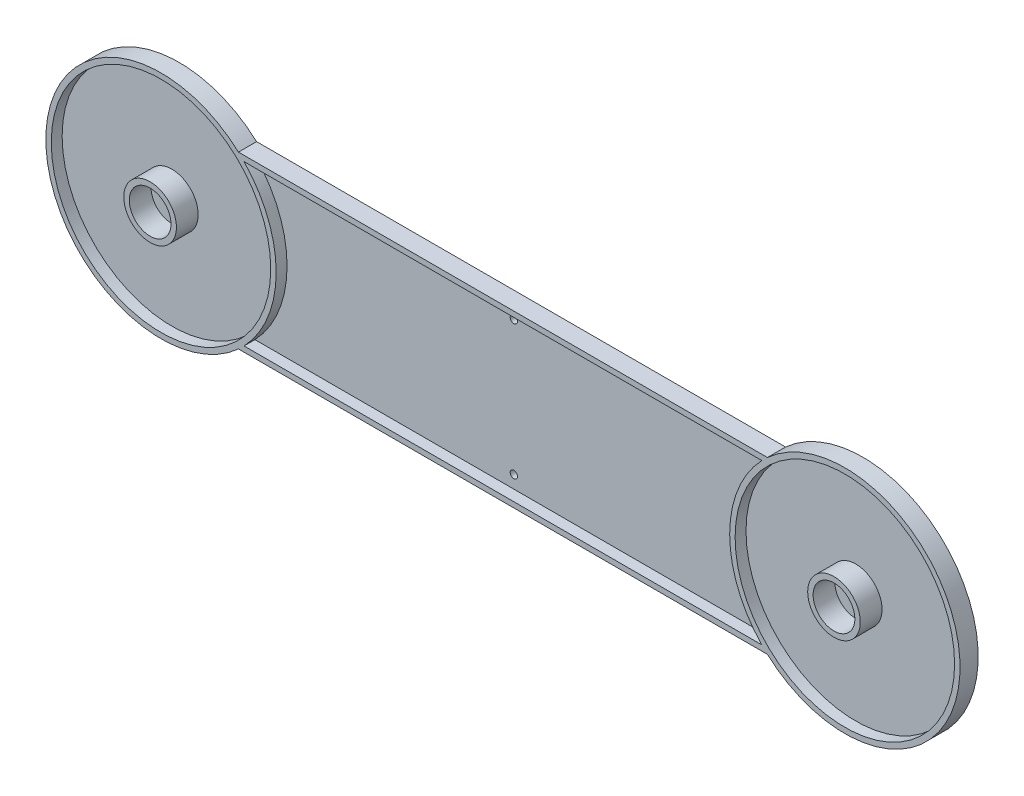
ISO-10303-21;
HEADER;
FILE_DESCRIPTION(('STEP AP214'),'2;1');
FILE_NAME('part.step','',(''),(''),'','','');
FILE_SCHEMA(('AUTOMOTIVE_DESIGN { 1 0 10303 214 1 1 1 1 }'));
ENDSEC;
DATA;
#1=APPLICATION_CONTEXT('core data for automotive mechanical design processes');
#2=APPLICATION_PROTOCOL_DEFINITION('international standard','automotive_design',2000,#1);
#3=PRODUCT_CONTEXT('',#1,'mechanical');
#4=PRODUCT('Part','Part','',(#3));
#5=PRODUCT_RELATED_PRODUCT_CATEGORY('part','',(#4));
#6=PRODUCT_DEFINITION_FORMATION('','',#4);
#7=PRODUCT_DEFINITION_CONTEXT('part definition',#1,'design');
#8=PRODUCT_DEFINITION('design','',#6,#7);
#9=PRODUCT_DEFINITION_SHAPE('','',#8);
#10=(LENGTH_UNIT() NAMED_UNIT(*) SI_UNIT(.MILLI.,.METRE.));
#11=(NAMED_UNIT(*) PLANE_ANGLE_UNIT() SI_UNIT($,.RADIAN.));
#12=(NAMED_UNIT(*) SI_UNIT($,.STERADIAN.) SOLID_ANGLE_UNIT());
#13=UNCERTAINTY_MEASURE_WITH_UNIT(LENGTH_MEASURE(1.E-05),#10,'distance_accuracy_value','');
#14=(GEOMETRIC_REPRESENTATION_CONTEXT(3) GLOBAL_UNCERTAINTY_ASSIGNED_CONTEXT((#13)) GLOBAL_UNIT_ASSIGNED_CONTEXT((#10,
#11,#12)) REPRESENTATION_CONTEXT('',''));
#15=CARTESIAN_POINT('',(0.,0.,0.));
#16=DIRECTION('',(0.,0.,1.));
#17=DIRECTION('',(1.,0.,0.));
#18=AXIS2_PLACEMENT_3D('',#15,#16,#17);
#19=CARTESIAN_POINT('',(-94.25,0.,2.));
#20=DIRECTION('',(0.,0.,-1.));
#21=DIRECTION('',(-1.,0.,0.));
#22=AXIS2_PLACEMENT_3D('',#19,#20,#21);
#23=CYLINDRICAL_SURFACE('',#22,31.75);
#24=CARTESIAN_POINT('',(-94.25,0.,0.));
#25=DIRECTION('',(0.,0.,1.));
#26=DIRECTION('',(1.,0.,0.));
#27=AXIS2_PLACEMENT_3D('',#24,#25,#26);
#28=CIRCLE('',#27,31.75);
#29=CARTESIAN_POINT('',(-72.9002341933219,23.5,0.));
#30=VERTEX_POINT('',#29);
#31=CARTESIAN_POINT('',(-72.9002341933219,-23.5,0.));
#32=VERTEX_POINT('',#31);
#33=EDGE_CURVE('E110',#30,#32,#28,.T.);
#34=ORIENTED_EDGE('',*,*,#33,.T.);
#35=DIRECTION('',(0.,0.,-1.));
#36=VECTOR('',#35,1.);
#37=CARTESIAN_POINT('',(-72.9002341933219,-23.5,2.));
#38=LINE('',#37,#36);
#39=CARTESIAN_POINT('',(-72.9002341933219,-23.5,5.));
#40=VERTEX_POINT('',#39);
#41=EDGE_CURVE('E176',#40,#32,#38,.T.);
#42=ORIENTED_EDGE('',*,*,#41,.F.);
#43=CARTESIAN_POINT('',(-94.25,0.,5.));
#44=DIRECTION('',(0.,0.,1.));
#45=DIRECTION('',(1.,0.,0.));
#46=AXIS2_PLACEMENT_3D('',#43,#44,#45);
#47=CIRCLE('',#46,31.75);
#48=CARTESIAN_POINT('',(-72.9002341933219,23.5,5.));
#49=VERTEX_POINT('',#48);
#50=EDGE_CURVE('E136',#49,#40,#47,.T.);
#51=ORIENTED_EDGE('',*,*,#50,.F.);
#52=DIRECTION('',(0.,0.,-1.));
#53=VECTOR('',#52,1.);
#54=CARTESIAN_POINT('',(-72.9002341933219,23.5,2.));
#55=LINE('',#54,#53);
#56=EDGE_CURVE('E167',#49,#30,#55,.T.);
#57=ORIENTED_EDGE('',*,*,#56,.T.);
#58=EDGE_LOOP('',(#34,#42,#51,#57));
#59=FACE_BOUND('',#58,.T.);
#60=ADVANCED_FACE('F38',(#59),#23,.T.);
#61=CARTESIAN_POINT('',(72.9002341933219,-23.5,2.));
#62=DIRECTION('',(0.,1.,0.));
#63=DIRECTION('',(-1.,0.,0.));
#64=AXIS2_PLACEMENT_3D('',#61,#62,#63);
#65=PLANE('',#64);
#66=DIRECTION('',(1.,0.,0.));
#67=VECTOR('',#66,1.);
#68=CARTESIAN_POINT('',(72.9002341933219,-23.5,0.));
#69=LINE('',#68,#67);
#70=CARTESIAN_POINT('',(72.9002341933219,-23.5,0.));
#71=VERTEX_POINT('',#70);
#72=EDGE_CURVE('E161',#32,#71,#69,.T.);
#73=ORIENTED_EDGE('',*,*,#72,.T.);
#74=DIRECTION('',(0.,0.,-1.));
#75=VECTOR('',#74,1.);
#76=CARTESIAN_POINT('',(72.9002341933219,-23.5,2.));
#77=LINE('',#76,#75);
#78=CARTESIAN_POINT('',(72.9002341933219,-23.5,5.));
#79=VERTEX_POINT('',#78);
#80=EDGE_CURVE('E173',#79,#71,#77,.T.);
#81=ORIENTED_EDGE('',*,*,#80,.F.);
#82=DIRECTION('',(1.,0.,0.));
#83=VECTOR('',#82,1.);
#84=CARTESIAN_POINT('',(0.,-23.5,5.));
#85=LINE('',#84,#83);
#86=EDGE_CURVE('E139',#40,#79,#85,.T.);
#87=ORIENTED_EDGE('',*,*,#86,.F.);
#88=ORIENTED_EDGE('',*,*,#41,.T.);
#89=EDGE_LOOP('',(#73,#81,#87,#88));
#90=FACE_BOUND('',#89,.T.);
#91=ADVANCED_FACE('F221',(#90),#65,.F.);
#92=CARTESIAN_POINT('',(94.25,0.,2.));
#93=DIRECTION('',(0.,0.,-1.));
#94=DIRECTION('',(-1.,0.,0.));
#95=AXIS2_PLACEMENT_3D('',#92,#93,#94);
#96=CYLINDRICAL_SURFACE('',#95,31.75);
#97=CARTESIAN_POINT('',(94.25,0.,0.));
#98=DIRECTION('',(0.,0.,1.));
#99=DIRECTION('',(1.,0.,0.));
#100=AXIS2_PLACEMENT_3D('',#97,#98,#99);
#101=CIRCLE('',#100,31.75);
#102=CARTESIAN_POINT('',(72.9002341933219,23.5,0.));
#103=VERTEX_POINT('',#102);
#104=EDGE_CURVE('E163',#71,#103,#101,.T.);
#105=ORIENTED_EDGE('',*,*,#104,.T.);
#106=DIRECTION('',(0.,0.,-1.));
#107=VECTOR('',#106,1.);
#108=CARTESIAN_POINT('',(72.9002341933219,23.5,2.));
#109=LINE('',#108,#107);
#110=CARTESIAN_POINT('',(72.9002341933219,23.5,5.));
#111=VERTEX_POINT('',#110);
#112=EDGE_CURVE('E170',#111,#103,#109,.T.);
#113=ORIENTED_EDGE('',*,*,#112,.F.);
#114=CARTESIAN_POINT('',(94.25,0.,5.));
#115=DIRECTION('',(0.,0.,1.));
#116=DIRECTION('',(1.,0.,0.));
#117=AXIS2_PLACEMENT_3D('',#114,#115,#116);
#118=CIRCLE('',#117,31.75);
#119=EDGE_CURVE('E142',#79,#111,#118,.T.);
#120=ORIENTED_EDGE('',*,*,#119,.F.);
#121=ORIENTED_EDGE('',*,*,#80,.T.);
#122=EDGE_LOOP('',(#105,#113,#120,#121));
#123=FACE_BOUND('',#122,.T.);
#124=ADVANCED_FACE('F226',(#123),#96,.T.);
#125=CARTESIAN_POINT('',(72.9002341933219,23.5,2.));
#126=DIRECTION('',(0.,-1.,0.));
#127=DIRECTION('',(1.,0.,0.));
#128=AXIS2_PLACEMENT_3D('',#125,#126,#127);
#129=PLANE('',#128);
#130=DIRECTION('',(-1.,0.,0.));
#131=VECTOR('',#130,1.);
#132=CARTESIAN_POINT('',(72.9002341933219,23.5,0.));
#133=LINE('',#132,#131);
#134=EDGE_CURVE('E165',#103,#30,#133,.T.);
#135=ORIENTED_EDGE('',*,*,#134,.T.);
#136=ORIENTED_EDGE('',*,*,#56,.F.);
#137=DIRECTION('',(-1.,0.,0.));
#138=VECTOR('',#137,1.);
#139=CARTESIAN_POINT('',(0.,23.5,5.));
#140=LINE('',#139,#138);
#141=EDGE_CURVE('E133',#111,#49,#140,.T.);
#142=ORIENTED_EDGE('',*,*,#141,.F.);
#143=ORIENTED_EDGE('',*,*,#112,.T.);
#144=EDGE_LOOP('',(#135,#136,#142,#143));
#145=FACE_BOUND('',#144,.T.);
#146=ADVANCED_FACE('F241',(#145),#129,.F.);
#147=CARTESIAN_POINT('',(-94.25,0.,0.));
#148=DIRECTION('',(0.,0.,1.));
#149=DIRECTION('',(1.,0.,0.));
#150=AXIS2_PLACEMENT_3D('',#147,#148,#149);
#151=PLANE('',#150);
#152=CARTESIAN_POINT('',(0.,-18.5,0.));
#153=DIRECTION('',(0.,0.,1.));
#154=DIRECTION('',(1.,0.,0.));
#155=AXIS2_PLACEMENT_3D('',#152,#153,#154);
#156=CIRCLE('',#155,1.);
#157=CARTESIAN_POINT('',(1.,-18.5,0.));
#158=VERTEX_POINT('',#157);
#159=EDGE_CURVE('E188',#158,#158,#156,.T.);
#160=ORIENTED_EDGE('',*,*,#159,.T.);
#161=EDGE_LOOP('',(#160));
#162=FACE_BOUND('',#161,.T.);
#163=CARTESIAN_POINT('',(0.,18.5,0.));
#164=DIRECTION('',(0.,0.,1.));
#165=DIRECTION('',(1.,0.,0.));
#166=AXIS2_PLACEMENT_3D('',#163,#164,#165);
#167=CIRCLE('',#166,1.);
#168=CARTESIAN_POINT('',(1.,18.5,0.));
#169=VERTEX_POINT('',#168);
#170=EDGE_CURVE('E466',#169,#169,#167,.T.);
#171=ORIENTED_EDGE('',*,*,#170,.T.);
#172=EDGE_LOOP('',(#171));
#173=FACE_BOUND('',#172,.T.);
#174=ORIENTED_EDGE('',*,*,#33,.F.);
#175=ORIENTED_EDGE('',*,*,#134,.F.);
#176=ORIENTED_EDGE('',*,*,#104,.F.);
#177=ORIENTED_EDGE('',*,*,#72,.F.);
#178=EDGE_LOOP('',(#174,#175,#176,#177));
#179=FACE_BOUND('',#178,.T.);
#180=ADVANCED_FACE('F232',(#162,#173,#179),#151,.F.);
#181=CARTESIAN_POINT('',(94.25,0.,5.));
#182=DIRECTION('',(0.,0.,-1.));
#183=DIRECTION('',(-1.,0.,0.));
#184=AXIS2_PLACEMENT_3D('',#181,#182,#183);
#185=CYLINDRICAL_SURFACE('',#184,31.75);
#186=CARTESIAN_POINT('',(94.25,0.,2.));
#187=DIRECTION('',(0.,0.,1.));
#188=DIRECTION('',(1.,0.,0.));
#189=AXIS2_PLACEMENT_3D('',#186,#187,#188);
#190=CIRCLE('',#189,31.75);
#191=CARTESIAN_POINT('',(71.3575885935972,-22.,2.));
#192=VERTEX_POINT('',#191);
#193=CARTESIAN_POINT('',(71.3575885935972,22.,2.));
#194=VERTEX_POINT('',#193);
#195=EDGE_CURVE('E107',#192,#194,#190,.F.);
#196=ORIENTED_EDGE('',*,*,#195,.F.);
#197=DIRECTION('',(0.,0.,-1.));
#198=VECTOR('',#197,1.);
#199=CARTESIAN_POINT('',(71.3575885935972,-22.,5.));
#200=LINE('',#199,#198);
#201=CARTESIAN_POINT('',(71.3575885935972,-22.,5.));
#202=VERTEX_POINT('',#201);
#203=EDGE_CURVE('E101',#202,#192,#200,.T.);
#204=ORIENTED_EDGE('',*,*,#203,.F.);
#205=CARTESIAN_POINT('',(94.25,0.,5.));
#206=DIRECTION('',(0.,0.,1.));
#207=DIRECTION('',(1.,0.,0.));
#208=AXIS2_PLACEMENT_3D('',#205,#206,#207);
#209=CIRCLE('',#208,31.75);
#210=CARTESIAN_POINT('',(71.3575885935972,22.,5.));
#211=VERTEX_POINT('',#210);
#212=EDGE_CURVE('E105',#202,#211,#209,.F.);
#213=ORIENTED_EDGE('',*,*,#212,.T.);
#214=DIRECTION('',(0.,0.,-1.));
#215=VECTOR('',#214,1.);
#216=CARTESIAN_POINT('',(71.3575885935972,22.,5.));
#217=LINE('',#216,#215);
#218=EDGE_CURVE('E148',#211,#194,#217,.T.);
#219=ORIENTED_EDGE('',*,*,#218,.T.);
#220=EDGE_LOOP('',(#196,#204,#213,#219));
#221=FACE_BOUND('',#220,.T.);
#222=ADVANCED_FACE('F103',(#221),#185,.T.);
#223=CARTESIAN_POINT('',(0.,-22.,5.));
#224=DIRECTION('',(0.,1.,0.));
#225=DIRECTION('',(0.,0.,1.));
#226=AXIS2_PLACEMENT_3D('',#223,#224,#225);
#227=PLANE('',#226);
#228=DIRECTION('',(1.,0.,0.));
#229=VECTOR('',#228,1.);
#230=CARTESIAN_POINT('',(0.,-22.,2.));
#231=LINE('',#230,#229);
#232=CARTESIAN_POINT('',(-71.3575885935972,-22.,2.));
#233=VERTEX_POINT('',#232);
#234=EDGE_CURVE('E52',#233,#192,#231,.T.);
#235=ORIENTED_EDGE('',*,*,#234,.F.);
#236=DIRECTION('',(0.,0.,-1.));
#237=VECTOR('',#236,1.);
#238=CARTESIAN_POINT('',(-71.3575885935972,-22.,5.));
#239=LINE('',#238,#237);
#240=CARTESIAN_POINT('',(-71.3575885935972,-22.,5.));
#241=VERTEX_POINT('',#240);
#242=EDGE_CURVE('E111',#241,#233,#239,.T.);
#243=ORIENTED_EDGE('',*,*,#242,.F.);
#244=DIRECTION('',(1.,0.,0.));
#245=VECTOR('',#244,1.);
#246=CARTESIAN_POINT('',(0.,-22.,5.));
#247=LINE('',#246,#245);
#248=EDGE_CURVE('E117',#241,#202,#247,.T.);
#249=ORIENTED_EDGE('',*,*,#248,.T.);
#250=ORIENTED_EDGE('',*,*,#203,.T.);
#251=EDGE_LOOP('',(#235,#243,#249,#250));
#252=FACE_BOUND('',#251,.T.);
#253=ADVANCED_FACE('F122',(#252),#227,.T.);
#254=CARTESIAN_POINT('',(-94.25,0.,5.));
#255=DIRECTION('',(0.,0.,-1.));
#256=DIRECTION('',(-1.,0.,0.));
#257=AXIS2_PLACEMENT_3D('',#254,#255,#256);
#258=CYLINDRICAL_SURFACE('',#257,31.75);
#259=CARTESIAN_POINT('',(-94.25,0.,2.));
#260=DIRECTION('',(0.,0.,1.));
#261=DIRECTION('',(1.,0.,0.));
#262=AXIS2_PLACEMENT_3D('',#259,#260,#261);
#263=CIRCLE('',#262,31.75);
#264=CARTESIAN_POINT('',(-71.3575885935972,22.,2.));
#265=VERTEX_POINT('',#264);
#266=EDGE_CURVE('E57',#233,#265,#263,.T.);
#267=ORIENTED_EDGE('',*,*,#266,.T.);
#268=DIRECTION('',(0.,0.,-1.));
#269=VECTOR('',#268,1.);
#270=CARTESIAN_POINT('',(-71.3575885935972,22.,5.));
#271=LINE('',#270,#269);
#272=CARTESIAN_POINT('',(-71.3575885935972,22.,5.));
#273=VERTEX_POINT('',#272);
#274=EDGE_CURVE('E155',#273,#265,#271,.T.);
#275=ORIENTED_EDGE('',*,*,#274,.F.);
#276=CARTESIAN_POINT('',(-94.25,0.,5.));
#277=DIRECTION('',(0.,0.,1.));
#278=DIRECTION('',(1.,0.,0.));
#279=AXIS2_PLACEMENT_3D('',#276,#277,#278);
#280=CIRCLE('',#279,31.75);
#281=EDGE_CURVE('E124',#241,#273,#280,.T.);
#282=ORIENTED_EDGE('',*,*,#281,.F.);
#283=ORIENTED_EDGE('',*,*,#242,.T.);
#284=EDGE_LOOP('',(#267,#275,#282,#283));
#285=FACE_BOUND('',#284,.T.);
#286=ADVANCED_FACE('F404',(#285),#258,.T.);
#287=CARTESIAN_POINT('',(-94.25,0.,5.));
#288=DIRECTION('',(0.,0.,-1.));
#289=DIRECTION('',(-1.,0.,0.));
#290=AXIS2_PLACEMENT_3D('',#287,#288,#289);
#291=CYLINDRICAL_SURFACE('',#290,30.25);
#292=CARTESIAN_POINT('',(-94.25,0.,5.));
#293=DIRECTION('',(0.,0.,1.));
#294=DIRECTION('',(1.,0.,0.));
#295=AXIS2_PLACEMENT_3D('',#292,#293,#294);
#296=CIRCLE('',#295,30.25);
#297=CARTESIAN_POINT('',(-64.,0.,5.));
#298=VERTEX_POINT('',#297);
#299=EDGE_CURVE('E130',#298,#298,#296,.T.);
#300=ORIENTED_EDGE('',*,*,#299,.T.);
#301=EDGE_LOOP('',(#300));
#302=FACE_BOUND('',#301,.T.);
#303=CARTESIAN_POINT('',(-94.25,0.,2.));
#304=DIRECTION('',(0.,0.,1.));
#305=DIRECTION('',(1.,0.,0.));
#306=AXIS2_PLACEMENT_3D('',#303,#304,#305);
#307=CIRCLE('',#306,30.25);
#308=CARTESIAN_POINT('',(-64.,0.,2.));
#309=VERTEX_POINT('',#308);
#310=EDGE_CURVE('E182',#309,#309,#307,.F.);
#311=ORIENTED_EDGE('',*,*,#310,.T.);
#312=EDGE_LOOP('',(#311));
#313=FACE_BOUND('',#312,.T.);
#314=ADVANCED_FACE('F394',(#302,#313),#291,.F.);
#315=CARTESIAN_POINT('',(0.,22.,5.));
#316=DIRECTION('',(0.,-1.,0.));
#317=DIRECTION('',(0.,0.,-1.));
#318=AXIS2_PLACEMENT_3D('',#315,#316,#317);
#319=PLANE('',#318);
#320=DIRECTION('',(-1.,0.,0.));
#321=VECTOR('',#320,1.);
#322=CARTESIAN_POINT('',(0.,22.,2.));
#323=LINE('',#322,#321);
#324=EDGE_CURVE('E120',#194,#265,#323,.T.);
#325=ORIENTED_EDGE('',*,*,#324,.F.);
#326=ORIENTED_EDGE('',*,*,#218,.F.);
#327=DIRECTION('',(-1.,0.,0.));
#328=VECTOR('',#327,1.);
#329=CARTESIAN_POINT('',(0.,22.,5.));
#330=LINE('',#329,#328);
#331=EDGE_CURVE('E119',#211,#273,#330,.T.);
#332=ORIENTED_EDGE('',*,*,#331,.T.);
#333=ORIENTED_EDGE('',*,*,#274,.T.);
#334=EDGE_LOOP('',(#325,#326,#332,#333));
#335=FACE_BOUND('',#334,.T.);
#336=ADVANCED_FACE('F381',(#335),#319,.T.);
#337=CARTESIAN_POINT('',(94.25,0.,5.));
#338=DIRECTION('',(0.,0.,-1.));
#339=DIRECTION('',(-1.,0.,0.));
#340=AXIS2_PLACEMENT_3D('',#337,#338,#339);
#341=CYLINDRICAL_SURFACE('',#340,30.25);
#342=CARTESIAN_POINT('',(94.25,0.,5.));
#343=DIRECTION('',(0.,0.,1.));
#344=DIRECTION('',(1.,0.,0.));
#345=AXIS2_PLACEMENT_3D('',#342,#343,#344);
#346=CIRCLE('',#345,30.25);
#347=CARTESIAN_POINT('',(124.5,0.,5.));
#348=VERTEX_POINT('',#347);
#349=EDGE_CURVE('E145',#348,#348,#346,.T.);
#350=ORIENTED_EDGE('',*,*,#349,.T.);
#351=EDGE_LOOP('',(#350));
#352=FACE_BOUND('',#351,.T.);
#353=CARTESIAN_POINT('',(94.25,0.,2.));
#354=DIRECTION('',(0.,0.,1.));
#355=DIRECTION('',(1.,0.,0.));
#356=AXIS2_PLACEMENT_3D('',#353,#354,#355);
#357=CIRCLE('',#356,30.25);
#358=CARTESIAN_POINT('',(124.5,0.,2.));
#359=VERTEX_POINT('',#358);
#360=EDGE_CURVE('E179',#359,#359,#357,.F.);
#361=ORIENTED_EDGE('',*,*,#360,.T.);
#362=EDGE_LOOP('',(#361));
#363=FACE_BOUND('',#362,.T.);
#364=ADVANCED_FACE('F373',(#352,#363),#341,.F.);
#365=CARTESIAN_POINT('',(0.,0.,5.));
#366=DIRECTION('',(0.,0.,1.));
#367=DIRECTION('',(1.,0.,0.));
#368=AXIS2_PLACEMENT_3D('',#365,#366,#367);
#369=PLANE('',#368);
#370=ORIENTED_EDGE('',*,*,#212,.F.);
#371=ORIENTED_EDGE('',*,*,#248,.F.);
#372=ORIENTED_EDGE('',*,*,#281,.T.);
#373=ORIENTED_EDGE('',*,*,#331,.F.);
#374=EDGE_LOOP('',(#370,#371,#372,#373));
#375=FACE_BOUND('',#374,.T.);
#376=ORIENTED_EDGE('',*,*,#299,.F.);
#377=EDGE_LOOP('',(#376));
#378=FACE_BOUND('',#377,.T.);
#379=ORIENTED_EDGE('',*,*,#141,.T.);
#380=ORIENTED_EDGE('',*,*,#50,.T.);
#381=ORIENTED_EDGE('',*,*,#86,.T.);
#382=ORIENTED_EDGE('',*,*,#119,.T.);
#383=EDGE_LOOP('',(#379,#380,#381,#382));
#384=FACE_BOUND('',#383,.T.);
#385=ORIENTED_EDGE('',*,*,#349,.F.);
#386=EDGE_LOOP('',(#385));
#387=FACE_BOUND('',#386,.T.);
#388=ADVANCED_FACE('F115',(#375,#378,#384,#387),#369,.T.);
#389=CARTESIAN_POINT('',(-94.25,0.,2.));
#390=DIRECTION('',(0.,0.,1.));
#391=DIRECTION('',(1.,0.,0.));
#392=AXIS2_PLACEMENT_3D('',#389,#390,#391);
#393=PLANE('',#392);
#394=CARTESIAN_POINT('',(94.25,0.,2.));
#395=DIRECTION('',(0.,0.,1.));
#396=DIRECTION('',(1.,0.,0.));
#397=AXIS2_PLACEMENT_3D('',#394,#395,#396);
#398=CIRCLE('',#397,7.25);
#399=CARTESIAN_POINT('',(101.5,0.,2.));
#400=VERTEX_POINT('',#399);
#401=EDGE_CURVE('E11',#400,#400,#398,.T.);
#402=ORIENTED_EDGE('',*,*,#401,.F.);
#403=EDGE_LOOP('',(#402));
#404=FACE_BOUND('',#403,.T.);
#405=ORIENTED_EDGE('',*,*,#360,.F.);
#406=EDGE_LOOP('',(#405));
#407=FACE_BOUND('',#406,.T.);
#408=ADVANCED_FACE('F215',(#404,#407),#393,.T.);
#409=CARTESIAN_POINT('',(0.,-18.5,2.));
#410=DIRECTION('',(0.,0.,1.));
#411=DIRECTION('',(1.,0.,0.));
#412=AXIS2_PLACEMENT_3D('',#409,#410,#411);
#413=CIRCLE('',#412,1.);
#414=CARTESIAN_POINT('',(1.,-18.5,2.));
#415=VERTEX_POINT('',#414);
#416=EDGE_CURVE('E150',#415,#415,#413,.T.);
#417=ORIENTED_EDGE('',*,*,#416,.F.);
#418=EDGE_LOOP('',(#417));
#419=FACE_BOUND('',#418,.T.);
#420=CARTESIAN_POINT('',(0.,18.5,2.));
#421=DIRECTION('',(0.,0.,1.));
#422=DIRECTION('',(1.,0.,0.));
#423=AXIS2_PLACEMENT_3D('',#420,#421,#422);
#424=CIRCLE('',#423,1.);
#425=CARTESIAN_POINT('',(1.,18.5,2.));
#426=VERTEX_POINT('',#425);
#427=EDGE_CURVE('E185',#426,#426,#424,.T.);
#428=ORIENTED_EDGE('',*,*,#427,.F.);
#429=EDGE_LOOP('',(#428));
#430=FACE_BOUND('',#429,.T.);
#431=ORIENTED_EDGE('',*,*,#195,.T.);
#432=ORIENTED_EDGE('',*,*,#324,.T.);
#433=ORIENTED_EDGE('',*,*,#266,.F.);
#434=ORIENTED_EDGE('',*,*,#234,.T.);
#435=EDGE_LOOP('',(#431,#432,#433,#434));
#436=FACE_BOUND('',#435,.T.);
#437=ADVANCED_FACE('F199',(#419,#430,#436),#393,.T.);
#438=CARTESIAN_POINT('',(-94.25,0.,2.));
#439=DIRECTION('',(0.,0.,1.));
#440=DIRECTION('',(1.,0.,0.));
#441=AXIS2_PLACEMENT_3D('',#438,#439,#440);
#442=CIRCLE('',#441,7.25);
#443=CARTESIAN_POINT('',(-87.,0.,2.));
#444=VERTEX_POINT('',#443);
#445=EDGE_CURVE('E462',#444,#444,#442,.T.);
#446=ORIENTED_EDGE('',*,*,#445,.F.);
#447=EDGE_LOOP('',(#446));
#448=FACE_BOUND('',#447,.T.);
#449=ORIENTED_EDGE('',*,*,#310,.F.);
#450=EDGE_LOOP('',(#449));
#451=FACE_BOUND('',#450,.T.);
#452=ADVANCED_FACE('F211',(#448,#451),#393,.T.);
#453=CARTESIAN_POINT('',(0.,18.5,0.));
#454=DIRECTION('',(0.,0.,1.));
#455=DIRECTION('',(1.,0.,0.));
#456=AXIS2_PLACEMENT_3D('',#453,#454,#455);
#457=CYLINDRICAL_SURFACE('',#456,1.);
#458=ORIENTED_EDGE('',*,*,#427,.T.);
#459=EDGE_LOOP('',(#458));
#460=FACE_BOUND('',#459,.T.);
#461=ORIENTED_EDGE('',*,*,#170,.F.);
#462=EDGE_LOOP('',(#461));
#463=FACE_BOUND('',#462,.T.);
#464=ADVANCED_FACE('F316',(#460,#463),#457,.F.);
#465=CARTESIAN_POINT('',(0.,-18.5,0.));
#466=DIRECTION('',(0.,0.,1.));
#467=DIRECTION('',(1.,0.,0.));
#468=AXIS2_PLACEMENT_3D('',#465,#466,#467);
#469=CYLINDRICAL_SURFACE('',#468,1.);
#470=ORIENTED_EDGE('',*,*,#416,.T.);
#471=EDGE_LOOP('',(#470));
#472=FACE_BOUND('',#471,.T.);
#473=ORIENTED_EDGE('',*,*,#159,.F.);
#474=EDGE_LOOP('',(#473));
#475=FACE_BOUND('',#474,.T.);
#476=ADVANCED_FACE('F325',(#472,#475),#469,.F.);
#477=CARTESIAN_POINT('',(-94.25,0.,8.));
#478=DIRECTION('',(0.,0.,1.));
#479=DIRECTION('',(1.,0.,0.));
#480=AXIS2_PLACEMENT_3D('',#477,#478,#479);
#481=PLANE('',#480);
#482=CARTESIAN_POINT('',(-94.25,0.,8.));
#483=DIRECTION('',(0.,0.,1.));
#484=DIRECTION('',(1.,0.,0.));
#485=AXIS2_PLACEMENT_3D('',#482,#483,#484);
#486=CIRCLE('',#485,7.25);
#487=CARTESIAN_POINT('',(-87.,0.,8.));
#488=VERTEX_POINT('',#487);
#489=EDGE_CURVE('E463',#488,#488,#486,.T.);
#490=ORIENTED_EDGE('',*,*,#489,.T.);
#491=EDGE_LOOP('',(#490));
#492=FACE_BOUND('',#491,.T.);
#493=CARTESIAN_POINT('',(-94.25,0.,8.));
#494=DIRECTION('',(0.,0.,1.));
#495=DIRECTION('',(1.,0.,0.));
#496=AXIS2_PLACEMENT_3D('',#493,#494,#495);
#497=CIRCLE('',#496,5.74999999999999);
#498=CARTESIAN_POINT('',(-88.5,0.,8.));
#499=VERTEX_POINT('',#498);
#500=EDGE_CURVE('E459',#499,#499,#497,.T.);
#501=ORIENTED_EDGE('',*,*,#500,.F.);
#502=EDGE_LOOP('',(#501));
#503=FACE_BOUND('',#502,.T.);
#504=ADVANCED_FACE('F329',(#492,#503),#481,.T.);
#505=CARTESIAN_POINT('',(-94.25,0.,8.));
#506=DIRECTION('',(0.,0.,-1.));
#507=DIRECTION('',(-1.,0.,0.));
#508=AXIS2_PLACEMENT_3D('',#505,#506,#507);
#509=CYLINDRICAL_SURFACE('',#508,7.25);
#510=ORIENTED_EDGE('',*,*,#489,.F.);
#511=EDGE_LOOP('',(#510));
#512=FACE_BOUND('',#511,.T.);
#513=ORIENTED_EDGE('',*,*,#445,.T.);
#514=EDGE_LOOP('',(#513));
#515=FACE_BOUND('',#514,.T.);
#516=ADVANCED_FACE('F208',(#512,#515),#509,.T.);
#517=CARTESIAN_POINT('',(-94.25,0.,8.));
#518=DIRECTION('',(0.,0.,-1.));
#519=DIRECTION('',(-1.,0.,0.));
#520=AXIS2_PLACEMENT_3D('',#517,#518,#519);
#521=CYLINDRICAL_SURFACE('',#520,5.74999999999999);
#522=ORIENTED_EDGE('',*,*,#500,.T.);
#523=EDGE_LOOP('',(#522));
#524=FACE_BOUND('',#523,.T.);
#525=CARTESIAN_POINT('',(-94.25,0.,2.));
#526=DIRECTION('',(0.,0.,1.));
#527=DIRECTION('',(1.,0.,0.));
#528=AXIS2_PLACEMENT_3D('',#525,#526,#527);
#529=CIRCLE('',#528,5.74999999999999);
#530=CARTESIAN_POINT('',(-88.5,0.,2.));
#531=VERTEX_POINT('',#530);
#532=EDGE_CURVE('E45',#531,#531,#529,.F.);
#533=ORIENTED_EDGE('',*,*,#532,.T.);
#534=EDGE_LOOP('',(#533));
#535=FACE_BOUND('',#534,.T.);
#536=ADVANCED_FACE('F193',(#524,#535),#521,.F.);
#537=ORIENTED_EDGE('',*,*,#532,.F.);
#538=EDGE_LOOP('',(#537));
#539=FACE_BOUND('',#538,.T.);
#540=ADVANCED_FACE('F195',(#539),#393,.T.);
#541=CARTESIAN_POINT('',(94.25,0.,8.));
#542=DIRECTION('',(0.,0.,-1.));
#543=DIRECTION('',(-1.,0.,0.));
#544=AXIS2_PLACEMENT_3D('',#541,#542,#543);
#545=CYLINDRICAL_SURFACE('',#544,7.25);
#546=CARTESIAN_POINT('',(94.25,0.,8.));
#547=DIRECTION('',(0.,0.,-1.));
#548=DIRECTION('',(-1.,0.,0.));
#549=AXIS2_PLACEMENT_3D('',#546,#547,#548);
#550=CIRCLE('',#549,7.25);
#551=CARTESIAN_POINT('',(87.,0.,8.));
#552=VERTEX_POINT('',#551);
#553=EDGE_CURVE('E454',#552,#552,#550,.T.);
#554=ORIENTED_EDGE('',*,*,#553,.T.);
#555=EDGE_LOOP('',(#554));
#556=FACE_BOUND('',#555,.T.);
#557=ORIENTED_EDGE('',*,*,#401,.T.);
#558=EDGE_LOOP('',(#557));
#559=FACE_BOUND('',#558,.T.);
#560=ADVANCED_FACE('F197',(#556,#559),#545,.T.);
#561=CARTESIAN_POINT('',(94.25,0.,8.));
#562=DIRECTION('',(0.,0.,1.));
#563=DIRECTION('',(-1.,0.,0.));
#564=AXIS2_PLACEMENT_3D('',#561,#562,#563);
#565=PLANE('',#564);
#566=CARTESIAN_POINT('',(94.25,0.,8.));
#567=DIRECTION('',(0.,0.,-1.));
#568=DIRECTION('',(-1.,0.,0.));
#569=AXIS2_PLACEMENT_3D('',#566,#567,#568);
#570=CIRCLE('',#569,5.74999999999999);
#571=CARTESIAN_POINT('',(88.5,0.,8.));
#572=VERTEX_POINT('',#571);
#573=EDGE_CURVE('E449',#572,#572,#570,.T.);
#574=ORIENTED_EDGE('',*,*,#573,.T.);
#575=EDGE_LOOP('',(#574));
#576=FACE_BOUND('',#575,.T.);
#577=ORIENTED_EDGE('',*,*,#553,.F.);
#578=EDGE_LOOP('',(#577));
#579=FACE_BOUND('',#578,.T.);
#580=ADVANCED_FACE('F205',(#576,#579),#565,.T.);
#581=CARTESIAN_POINT('',(94.25,0.,8.));
#582=DIRECTION('',(0.,0.,-1.));
#583=DIRECTION('',(-1.,0.,0.));
#584=AXIS2_PLACEMENT_3D('',#581,#582,#583);
#585=CYLINDRICAL_SURFACE('',#584,5.74999999999999);
#586=ORIENTED_EDGE('',*,*,#573,.F.);
#587=EDGE_LOOP('',(#586));
#588=FACE_BOUND('',#587,.T.);
#589=CARTESIAN_POINT('',(94.25,0.,2.));
#590=DIRECTION('',(0.,0.,-1.));
#591=DIRECTION('',(-1.,0.,0.));
#592=AXIS2_PLACEMENT_3D('',#589,#590,#591);
#593=CIRCLE('',#592,5.74999999999999);
#594=CARTESIAN_POINT('',(88.5,0.,2.));
#595=VERTEX_POINT('',#594);
#596=EDGE_CURVE('E452',#595,#595,#593,.T.);
#597=ORIENTED_EDGE('',*,*,#596,.T.);
#598=EDGE_LOOP('',(#597));
#599=FACE_BOUND('',#598,.T.);
#600=ADVANCED_FACE('F218',(#588,#599),#585,.F.);
#601=ORIENTED_EDGE('',*,*,#596,.F.);
#602=EDGE_LOOP('',(#601));
#603=FACE_BOUND('',#602,.T.);
#604=ADVANCED_FACE('F200',(#603),#393,.T.);
#605=CLOSED_SHELL('',(#60,#91,#124,#146,#180,#222,#253,#286,#314,#336,#364,#388,#408,#437,#452,
#464,#476,#504,#516,#536,#540,#560,#580,#600,#604));
#606=MANIFOLD_SOLID_BREP('B2',#605);
#607=ADVANCED_BREP_SHAPE_REPRESENTATION('',(#18,#606),#14);
#608=SHAPE_DEFINITION_REPRESENTATION(#9,#607);
ENDSEC;
END-ISO-10303-21;
